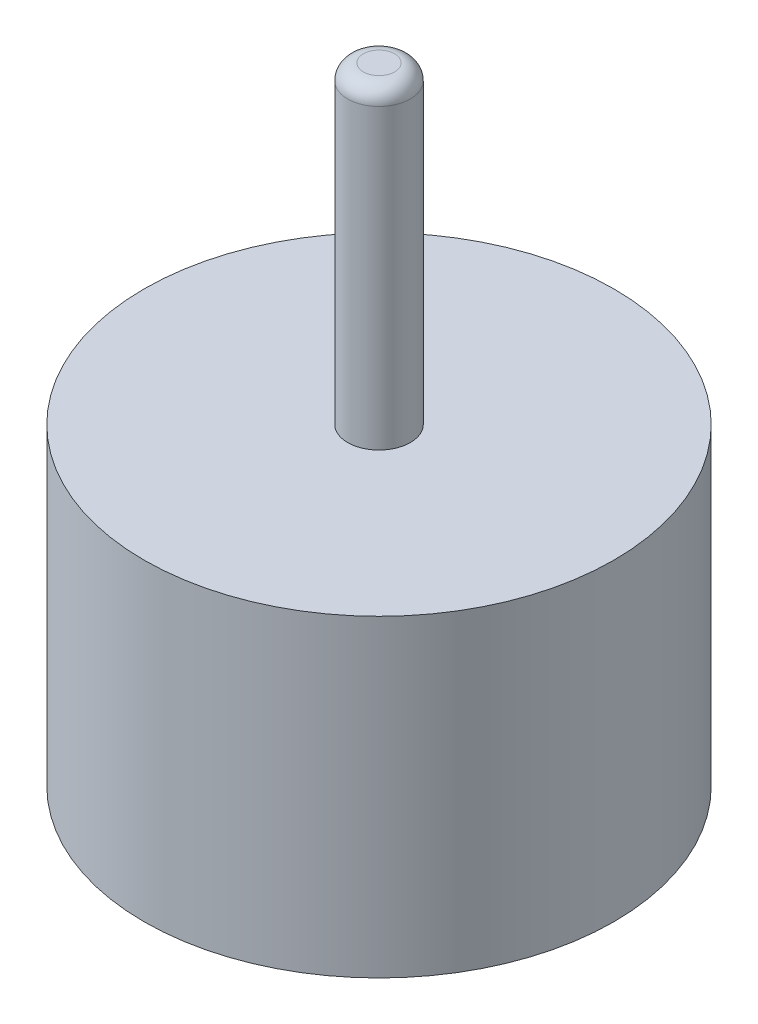
ISO-10303-21;
HEADER;
FILE_DESCRIPTION(('STEP AP214'),'2;1');
FILE_NAME('part.step','',(''),(''),'','','');
FILE_SCHEMA(('AUTOMOTIVE_DESIGN { 1 0 10303 214 1 1 1 1 }'));
ENDSEC;
DATA;
#1=APPLICATION_CONTEXT('core data for automotive mechanical design processes');
#2=APPLICATION_PROTOCOL_DEFINITION('international standard','automotive_design',2000,#1);
#3=PRODUCT_CONTEXT('',#1,'mechanical');
#4=PRODUCT('Part','Part','',(#3));
#5=PRODUCT_RELATED_PRODUCT_CATEGORY('part','',(#4));
#6=PRODUCT_DEFINITION_FORMATION('','',#4);
#7=PRODUCT_DEFINITION_CONTEXT('part definition',#1,'design');
#8=PRODUCT_DEFINITION('design','',#6,#7);
#9=PRODUCT_DEFINITION_SHAPE('','',#8);
#10=(LENGTH_UNIT() NAMED_UNIT(*) SI_UNIT(.MILLI.,.METRE.));
#11=(NAMED_UNIT(*) PLANE_ANGLE_UNIT() SI_UNIT($,.RADIAN.));
#12=(NAMED_UNIT(*) SI_UNIT($,.STERADIAN.) SOLID_ANGLE_UNIT());
#13=UNCERTAINTY_MEASURE_WITH_UNIT(LENGTH_MEASURE(1.E-05),#10,'distance_accuracy_value','');
#14=(GEOMETRIC_REPRESENTATION_CONTEXT(3) GLOBAL_UNCERTAINTY_ASSIGNED_CONTEXT((#13)) GLOBAL_UNIT_ASSIGNED_CONTEXT((#10,
#11,#12)) REPRESENTATION_CONTEXT('',''));
#15=CARTESIAN_POINT('',(0.,0.,0.));
#16=DIRECTION('',(0.,0.,1.));
#17=DIRECTION('',(1.,0.,0.));
#18=AXIS2_PLACEMENT_3D('',#15,#16,#17);
#19=CARTESIAN_POINT('',(0.,100.,0.));
#20=DIRECTION('',(0.,1.,0.));
#21=DIRECTION('',(0.,0.,1.));
#22=AXIS2_PLACEMENT_3D('',#19,#20,#21);
#23=PLANE('',#22);
#24=CARTESIAN_POINT('',(0.,100.,0.));
#25=DIRECTION('',(0.,1.,0.));
#26=DIRECTION('',(0.,0.,1.));
#27=AXIS2_PLACEMENT_3D('',#24,#25,#26);
#28=CIRCLE('',#27,75.);
#29=CARTESIAN_POINT('',(0.,100.,75.));
#30=VERTEX_POINT('',#29);
#31=EDGE_CURVE('E43',#30,#30,#28,.T.);
#32=ORIENTED_EDGE('',*,*,#31,.T.);
#33=EDGE_LOOP('',(#32));
#34=FACE_BOUND('',#33,.T.);
#35=CARTESIAN_POINT('',(0.,100.,0.));
#36=DIRECTION('',(0.,1.,0.));
#37=DIRECTION('',(0.,0.,1.));
#38=AXIS2_PLACEMENT_3D('',#35,#36,#37);
#39=CIRCLE('',#38,10.);
#40=CARTESIAN_POINT('',(0.,100.,10.));
#41=VERTEX_POINT('',#40);
#42=EDGE_CURVE('E51',#41,#41,#39,.T.);
#43=ORIENTED_EDGE('',*,*,#42,.F.);
#44=EDGE_LOOP('',(#43));
#45=FACE_BOUND('',#44,.T.);
#46=ADVANCED_FACE('F32',(#34,#45),#23,.T.);
#47=CARTESIAN_POINT('',(0.,100.,0.));
#48=DIRECTION('',(0.,-1.,0.));
#49=DIRECTION('',(0.,0.,-1.));
#50=AXIS2_PLACEMENT_3D('',#47,#48,#49);
#51=CYLINDRICAL_SURFACE('',#50,75.);
#52=ORIENTED_EDGE('',*,*,#31,.F.);
#53=EDGE_LOOP('',(#52));
#54=FACE_BOUND('',#53,.T.);
#55=CARTESIAN_POINT('',(0.,0.,0.));
#56=DIRECTION('',(0.,1.,0.));
#57=DIRECTION('',(0.,0.,1.));
#58=AXIS2_PLACEMENT_3D('',#55,#56,#57);
#59=CIRCLE('',#58,75.);
#60=CARTESIAN_POINT('',(0.,0.,75.));
#61=VERTEX_POINT('',#60);
#62=EDGE_CURVE('E47',#61,#61,#59,.T.);
#63=ORIENTED_EDGE('',*,*,#62,.T.);
#64=EDGE_LOOP('',(#63));
#65=FACE_BOUND('',#64,.T.);
#66=ADVANCED_FACE('F59',(#54,#65),#51,.T.);
#67=CARTESIAN_POINT('',(0.,0.,0.));
#68=DIRECTION('',(0.,1.,0.));
#69=DIRECTION('',(0.,0.,1.));
#70=AXIS2_PLACEMENT_3D('',#67,#68,#69);
#71=PLANE('',#70);
#72=ORIENTED_EDGE('',*,*,#62,.F.);
#73=EDGE_LOOP('',(#72));
#74=FACE_BOUND('',#73,.T.);
#75=ADVANCED_FACE('F65',(#74),#71,.F.);
#76=CARTESIAN_POINT('',(0.,200.,0.));
#77=DIRECTION('',(0.,-1.,0.));
#78=DIRECTION('',(0.,0.,-1.));
#79=AXIS2_PLACEMENT_3D('',#76,#77,#78);
#80=CYLINDRICAL_SURFACE('',#79,10.);
#81=CARTESIAN_POINT('',(0.,195.,0.));
#82=DIRECTION('',(0.,1.,0.));
#83=DIRECTION('',(0.,0.,1.));
#84=AXIS2_PLACEMENT_3D('',#81,#82,#83);
#85=CIRCLE('',#84,10.);
#86=CARTESIAN_POINT('',(0.,195.,10.));
#87=VERTEX_POINT('',#86);
#88=EDGE_CURVE('E10',#87,#87,#85,.F.);
#89=ORIENTED_EDGE('',*,*,#88,.T.);
#90=EDGE_LOOP('',(#89));
#91=FACE_BOUND('',#90,.T.);
#92=ORIENTED_EDGE('',*,*,#42,.T.);
#93=EDGE_LOOP('',(#92));
#94=FACE_BOUND('',#93,.T.);
#95=ADVANCED_FACE('F56',(#91,#94),#80,.T.);
#96=CARTESIAN_POINT('',(0.,200.,0.));
#97=DIRECTION('',(0.,1.,0.));
#98=DIRECTION('',(0.,0.,1.));
#99=AXIS2_PLACEMENT_3D('',#96,#97,#98);
#100=PLANE('',#99);
#101=CARTESIAN_POINT('',(0.,200.,0.));
#102=DIRECTION('',(0.,1.,0.));
#103=DIRECTION('',(0.,0.,1.));
#104=AXIS2_PLACEMENT_3D('',#101,#102,#103);
#105=CIRCLE('',#104,5.);
#106=CARTESIAN_POINT('',(0.,200.,5.));
#107=VERTEX_POINT('',#106);
#108=EDGE_CURVE('E39',#107,#107,#105,.T.);
#109=ORIENTED_EDGE('',*,*,#108,.T.);
#110=EDGE_LOOP('',(#109));
#111=FACE_BOUND('',#110,.T.);
#112=ADVANCED_FACE('F75',(#111),#100,.T.);
#113=CARTESIAN_POINT('',(0.,195.,0.));
#114=DIRECTION('',(0.,1.,0.));
#115=DIRECTION('',(0.,0.,1.));
#116=AXIS2_PLACEMENT_3D('',#113,#114,#115);
#117=DEGENERATE_TOROIDAL_SURFACE('',#116,5.,5.,.T.);
#118=ORIENTED_EDGE('',*,*,#88,.F.);
#119=EDGE_LOOP('',(#118));
#120=FACE_BOUND('',#119,.T.);
#121=ORIENTED_EDGE('',*,*,#108,.F.);
#122=EDGE_LOOP('',(#121));
#123=FACE_BOUND('',#122,.T.);
#124=ADVANCED_FACE('F34',(#120,#123),#117,.T.);
#125=CLOSED_SHELL('',(#46,#66,#75,#95,#112,#124));
#126=MANIFOLD_SOLID_BREP('B2',#125);
#127=ADVANCED_BREP_SHAPE_REPRESENTATION('',(#18,#126),#14);
#128=SHAPE_DEFINITION_REPRESENTATION(#9,#127);
ENDSEC;
END-ISO-10303-21;
